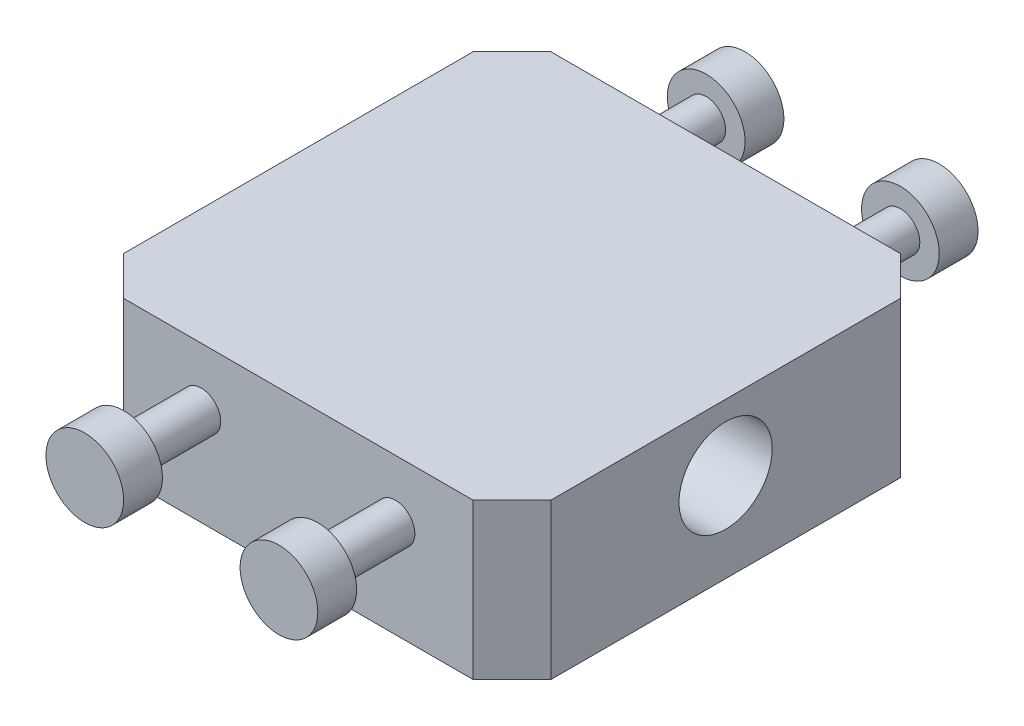
ISO-10303-21;
HEADER;
FILE_DESCRIPTION(('STEP AP214'),'2;1');
FILE_NAME('part.step','',(''),(''),'','','');
FILE_SCHEMA(('AUTOMOTIVE_DESIGN { 1 0 10303 214 1 1 1 1 }'));
ENDSEC;
DATA;
#1=APPLICATION_CONTEXT('core data for automotive mechanical design processes');
#2=APPLICATION_PROTOCOL_DEFINITION('international standard','automotive_design',2000,#1);
#3=PRODUCT_CONTEXT('',#1,'mechanical');
#4=PRODUCT('Part','Part','',(#3));
#5=PRODUCT_RELATED_PRODUCT_CATEGORY('part','',(#4));
#6=PRODUCT_DEFINITION_FORMATION('','',#4);
#7=PRODUCT_DEFINITION_CONTEXT('part definition',#1,'design');
#8=PRODUCT_DEFINITION('design','',#6,#7);
#9=PRODUCT_DEFINITION_SHAPE('','',#8);
#10=(LENGTH_UNIT() NAMED_UNIT(*) SI_UNIT(.MILLI.,.METRE.));
#11=(NAMED_UNIT(*) PLANE_ANGLE_UNIT() SI_UNIT($,.RADIAN.));
#12=(NAMED_UNIT(*) SI_UNIT($,.STERADIAN.) SOLID_ANGLE_UNIT());
#13=UNCERTAINTY_MEASURE_WITH_UNIT(LENGTH_MEASURE(1.E-05),#10,'distance_accuracy_value','');
#14=(GEOMETRIC_REPRESENTATION_CONTEXT(3) GLOBAL_UNCERTAINTY_ASSIGNED_CONTEXT((#13)) GLOBAL_UNIT_ASSIGNED_CONTEXT((#10,
#11,#12)) REPRESENTATION_CONTEXT('',''));
#15=CARTESIAN_POINT('',(0.,0.,0.));
#16=DIRECTION('',(0.,0.,1.));
#17=DIRECTION('',(1.,0.,0.));
#18=AXIS2_PLACEMENT_3D('',#15,#16,#17);
#19=CARTESIAN_POINT('',(0.,30.,0.));
#20=DIRECTION('',(1.,0.,0.));
#21=DIRECTION('',(0.,0.,-1.));
#22=AXIS2_PLACEMENT_3D('',#19,#20,#21);
#23=PLANE('',#22);
#24=CARTESIAN_POINT('',(0.,18.,-55.));
#25=DIRECTION('',(1.,0.,0.));
#26=DIRECTION('',(0.,0.,-1.));
#27=AXIS2_PLACEMENT_3D('',#24,#25,#26);
#28=CIRCLE('',#27,12.);
#29=CARTESIAN_POINT('',(0.,18.,-67.));
#30=VERTEX_POINT('',#29);
#31=EDGE_CURVE('E133',#30,#30,#28,.T.);
#32=ORIENTED_EDGE('',*,*,#31,.T.);
#33=EDGE_LOOP('',(#32));
#34=FACE_BOUND('',#33,.T.);
#35=DIRECTION('',(0.,1.,0.));
#36=VECTOR('',#35,1.);
#37=CARTESIAN_POINT('',(0.,30.,-10.));
#38=LINE('',#37,#36);
#39=CARTESIAN_POINT('',(0.,-5.,-10.));
#40=VERTEX_POINT('',#39);
#41=CARTESIAN_POINT('',(0.,35.,-10.));
#42=VERTEX_POINT('',#41);
#43=EDGE_CURVE('E109',#40,#42,#38,.T.);
#44=ORIENTED_EDGE('',*,*,#43,.T.);
#45=DIRECTION('',(0.,0.,1.));
#46=VECTOR('',#45,1.);
#47=CARTESIAN_POINT('',(0.,35.,-10.));
#48=LINE('',#47,#46);
#49=CARTESIAN_POINT('',(0.,35.,-100.));
#50=VERTEX_POINT('',#49);
#51=EDGE_CURVE('E156',#50,#42,#48,.T.);
#52=ORIENTED_EDGE('',*,*,#51,.F.);
#53=DIRECTION('',(0.,-1.,0.));
#54=VECTOR('',#53,1.);
#55=CARTESIAN_POINT('',(0.,30.,-100.));
#56=LINE('',#55,#54);
#57=CARTESIAN_POINT('',(0.,-5.,-100.));
#58=VERTEX_POINT('',#57);
#59=EDGE_CURVE('E118',#50,#58,#56,.T.);
#60=ORIENTED_EDGE('',*,*,#59,.T.);
#61=DIRECTION('',(0.,0.,-1.));
#62=VECTOR('',#61,1.);
#63=CARTESIAN_POINT('',(0.,-5.,-100.));
#64=LINE('',#63,#62);
#65=EDGE_CURVE('E122',#40,#58,#64,.T.);
#66=ORIENTED_EDGE('',*,*,#65,.F.);
#67=EDGE_LOOP('',(#44,#52,#60,#66));
#68=FACE_BOUND('',#67,.T.);
#69=ADVANCED_FACE('F41',(#34,#68),#23,.F.);
#70=CARTESIAN_POINT('',(0.,30.,0.));
#71=DIRECTION('',(0.,0.,-1.));
#72=DIRECTION('',(-1.,0.,0.));
#73=AXIS2_PLACEMENT_3D('',#70,#71,#72);
#74=PLANE('',#73);
#75=CARTESIAN_POINT('',(80.,20.,0.));
#76=DIRECTION('',(0.,0.,-1.));
#77=DIRECTION('',(-1.,0.,0.));
#78=AXIS2_PLACEMENT_3D('',#75,#76,#77);
#79=CIRCLE('',#78,5.);
#80=CARTESIAN_POINT('',(75.,20.,0.));
#81=VERTEX_POINT('',#80);
#82=EDGE_CURVE('E221',#81,#81,#79,.F.);
#83=ORIENTED_EDGE('',*,*,#82,.F.);
#84=EDGE_LOOP('',(#83));
#85=FACE_BOUND('',#84,.T.);
#86=CARTESIAN_POINT('',(30.,20.,0.));
#87=DIRECTION('',(0.,0.,-1.));
#88=DIRECTION('',(-1.,0.,0.));
#89=AXIS2_PLACEMENT_3D('',#86,#87,#88);
#90=CIRCLE('',#89,5.);
#91=CARTESIAN_POINT('',(25.,20.,0.));
#92=VERTEX_POINT('',#91);
#93=EDGE_CURVE('E218',#92,#92,#90,.F.);
#94=ORIENTED_EDGE('',*,*,#93,.F.);
#95=EDGE_LOOP('',(#94));
#96=FACE_BOUND('',#95,.T.);
#97=DIRECTION('',(0.,-1.,0.));
#98=VECTOR('',#97,1.);
#99=CARTESIAN_POINT('',(9.99999999999998,30.,0.));
#100=LINE('',#99,#98);
#101=CARTESIAN_POINT('',(9.99999999999998,35.,0.));
#102=VERTEX_POINT('',#101);
#103=CARTESIAN_POINT('',(9.99999999999998,-5.,0.));
#104=VERTEX_POINT('',#103);
#105=EDGE_CURVE('E214',#102,#104,#100,.T.);
#106=ORIENTED_EDGE('',*,*,#105,.T.);
#107=DIRECTION('',(-1.,0.,0.));
#108=VECTOR('',#107,1.);
#109=CARTESIAN_POINT('',(9.99999999999998,-5.,0.));
#110=LINE('',#109,#108);
#111=CARTESIAN_POINT('',(100.,-5.,0.));
#112=VERTEX_POINT('',#111);
#113=EDGE_CURVE('E132',#112,#104,#110,.T.);
#114=ORIENTED_EDGE('',*,*,#113,.F.);
#115=DIRECTION('',(0.,1.,0.));
#116=VECTOR('',#115,1.);
#117=CARTESIAN_POINT('',(100.,30.,0.));
#118=LINE('',#117,#116);
#119=CARTESIAN_POINT('',(100.,35.,0.));
#120=VERTEX_POINT('',#119);
#121=EDGE_CURVE('E216',#112,#120,#118,.T.);
#122=ORIENTED_EDGE('',*,*,#121,.T.);
#123=DIRECTION('',(1.,0.,0.));
#124=VECTOR('',#123,1.);
#125=CARTESIAN_POINT('',(100.,35.,0.));
#126=LINE('',#125,#124);
#127=EDGE_CURVE('E159',#102,#120,#126,.T.);
#128=ORIENTED_EDGE('',*,*,#127,.F.);
#129=EDGE_LOOP('',(#106,#114,#122,#128));
#130=FACE_BOUND('',#129,.T.);
#131=ADVANCED_FACE('F246',(#85,#96,#130),#74,.F.);
#132=CARTESIAN_POINT('',(110.,30.,0.));
#133=DIRECTION('',(-1.,0.,0.));
#134=DIRECTION('',(0.,0.,1.));
#135=AXIS2_PLACEMENT_3D('',#132,#133,#134);
#136=PLANE('',#135);
#137=CARTESIAN_POINT('',(110.,18.,-55.));
#138=DIRECTION('',(1.,0.,0.));
#139=DIRECTION('',(0.,0.,-1.));
#140=AXIS2_PLACEMENT_3D('',#137,#138,#139);
#141=CIRCLE('',#140,12.);
#142=CARTESIAN_POINT('',(110.,18.,-67.));
#143=VERTEX_POINT('',#142);
#144=EDGE_CURVE('E136',#143,#143,#141,.T.);
#145=ORIENTED_EDGE('',*,*,#144,.F.);
#146=EDGE_LOOP('',(#145));
#147=FACE_BOUND('',#146,.T.);
#148=DIRECTION('',(0.,-1.,0.));
#149=VECTOR('',#148,1.);
#150=CARTESIAN_POINT('',(110.,30.,-9.99999999999998));
#151=LINE('',#150,#149);
#152=CARTESIAN_POINT('',(110.,35.,-9.99999999999998));
#153=VERTEX_POINT('',#152);
#154=CARTESIAN_POINT('',(110.,-5.,-9.99999999999998));
#155=VERTEX_POINT('',#154);
#156=EDGE_CURVE('E210',#153,#155,#151,.T.);
#157=ORIENTED_EDGE('',*,*,#156,.T.);
#158=DIRECTION('',(0.,0.,1.));
#159=VECTOR('',#158,1.);
#160=CARTESIAN_POINT('',(110.,-5.,-9.99999999999998));
#161=LINE('',#160,#159);
#162=CARTESIAN_POINT('',(110.,-5.,-100.));
#163=VERTEX_POINT('',#162);
#164=EDGE_CURVE('E147',#163,#155,#161,.T.);
#165=ORIENTED_EDGE('',*,*,#164,.F.);
#166=DIRECTION('',(0.,1.,0.));
#167=VECTOR('',#166,1.);
#168=CARTESIAN_POINT('',(110.,30.,-100.));
#169=LINE('',#168,#167);
#170=CARTESIAN_POINT('',(110.,35.,-100.));
#171=VERTEX_POINT('',#170);
#172=EDGE_CURVE('E212',#163,#171,#169,.T.);
#173=ORIENTED_EDGE('',*,*,#172,.T.);
#174=DIRECTION('',(0.,0.,-1.));
#175=VECTOR('',#174,1.);
#176=CARTESIAN_POINT('',(110.,35.,-100.));
#177=LINE('',#176,#175);
#178=EDGE_CURVE('E165',#153,#171,#177,.T.);
#179=ORIENTED_EDGE('',*,*,#178,.F.);
#180=EDGE_LOOP('',(#157,#165,#173,#179));
#181=FACE_BOUND('',#180,.T.);
#182=ADVANCED_FACE('F231',(#147,#181),#136,.F.);
#183=CARTESIAN_POINT('',(0.,30.,-110.));
#184=DIRECTION('',(0.,0.,1.));
#185=DIRECTION('',(1.,0.,0.));
#186=AXIS2_PLACEMENT_3D('',#183,#184,#185);
#187=PLANE('',#186);
#188=CARTESIAN_POINT('',(30.,20.,-110.));
#189=DIRECTION('',(0.,0.,1.));
#190=DIRECTION('',(1.,0.,0.));
#191=AXIS2_PLACEMENT_3D('',#188,#189,#190);
#192=CIRCLE('',#191,5.);
#193=CARTESIAN_POINT('',(35.,20.,-110.));
#194=VERTEX_POINT('',#193);
#195=EDGE_CURVE('E11',#194,#194,#192,.F.);
#196=ORIENTED_EDGE('',*,*,#195,.F.);
#197=EDGE_LOOP('',(#196));
#198=FACE_BOUND('',#197,.T.);
#199=CARTESIAN_POINT('',(80.,20.,-110.));
#200=DIRECTION('',(0.,0.,1.));
#201=DIRECTION('',(1.,0.,0.));
#202=AXIS2_PLACEMENT_3D('',#199,#200,#201);
#203=CIRCLE('',#202,5.);
#204=CARTESIAN_POINT('',(85.,20.,-110.));
#205=VERTEX_POINT('',#204);
#206=EDGE_CURVE('E50',#205,#205,#203,.F.);
#207=ORIENTED_EDGE('',*,*,#206,.F.);
#208=EDGE_LOOP('',(#207));
#209=FACE_BOUND('',#208,.T.);
#210=DIRECTION('',(0.,-1.,0.));
#211=VECTOR('',#210,1.);
#212=CARTESIAN_POINT('',(100.,30.,-110.));
#213=LINE('',#212,#211);
#214=CARTESIAN_POINT('',(100.,35.,-110.));
#215=VERTEX_POINT('',#214);
#216=CARTESIAN_POINT('',(100.,-5.,-110.));
#217=VERTEX_POINT('',#216);
#218=EDGE_CURVE('E65',#215,#217,#213,.T.);
#219=ORIENTED_EDGE('',*,*,#218,.T.);
#220=DIRECTION('',(1.,0.,0.));
#221=VECTOR('',#220,1.);
#222=CARTESIAN_POINT('',(100.,-5.,-110.));
#223=LINE('',#222,#221);
#224=CARTESIAN_POINT('',(10.,-5.,-110.));
#225=VERTEX_POINT('',#224);
#226=EDGE_CURVE('E141',#225,#217,#223,.T.);
#227=ORIENTED_EDGE('',*,*,#226,.F.);
#228=DIRECTION('',(0.,1.,0.));
#229=VECTOR('',#228,1.);
#230=CARTESIAN_POINT('',(10.,30.,-110.));
#231=LINE('',#230,#229);
#232=CARTESIAN_POINT('',(10.,35.,-110.));
#233=VERTEX_POINT('',#232);
#234=EDGE_CURVE('E57',#225,#233,#231,.T.);
#235=ORIENTED_EDGE('',*,*,#234,.T.);
#236=DIRECTION('',(-1.,0.,0.));
#237=VECTOR('',#236,1.);
#238=CARTESIAN_POINT('',(10.,35.,-110.));
#239=LINE('',#238,#237);
#240=EDGE_CURVE('E170',#215,#233,#239,.T.);
#241=ORIENTED_EDGE('',*,*,#240,.F.);
#242=EDGE_LOOP('',(#219,#227,#235,#241));
#243=FACE_BOUND('',#242,.T.);
#244=ADVANCED_FACE('F228',(#198,#209,#243),#187,.F.);
#245=CARTESIAN_POINT('',(0.,30.,-100.));
#246=DIRECTION('',(0.707106781186546,0.,0.707106781186549));
#247=DIRECTION('',(0.,-1.,0.));
#248=AXIS2_PLACEMENT_3D('',#245,#246,#247);
#249=PLANE('',#248);
#250=ORIENTED_EDGE('',*,*,#59,.F.);
#251=DIRECTION('',(-0.707106781186549,0.,0.707106781186546));
#252=VECTOR('',#251,1.);
#253=CARTESIAN_POINT('',(0.,35.,-100.));
#254=LINE('',#253,#252);
#255=EDGE_CURVE('E153',#233,#50,#254,.T.);
#256=ORIENTED_EDGE('',*,*,#255,.F.);
#257=ORIENTED_EDGE('',*,*,#234,.F.);
#258=DIRECTION('',(0.707106781186549,0.,-0.707106781186546));
#259=VECTOR('',#258,1.);
#260=CARTESIAN_POINT('',(10.,-5.,-110.));
#261=LINE('',#260,#259);
#262=EDGE_CURVE('E126',#58,#225,#261,.T.);
#263=ORIENTED_EDGE('',*,*,#262,.F.);
#264=EDGE_LOOP('',(#250,#256,#257,#263));
#265=FACE_BOUND('',#264,.T.);
#266=ADVANCED_FACE('F230',(#265),#249,.F.);
#267=CARTESIAN_POINT('',(100.,30.,-110.));
#268=DIRECTION('',(-0.707106781186549,0.,0.707106781186546));
#269=DIRECTION('',(0.,-1.,0.));
#270=AXIS2_PLACEMENT_3D('',#267,#268,#269);
#271=PLANE('',#270);
#272=ORIENTED_EDGE('',*,*,#218,.F.);
#273=DIRECTION('',(-0.707106781186546,0.,-0.707106781186549));
#274=VECTOR('',#273,1.);
#275=CARTESIAN_POINT('',(100.,35.,-110.));
#276=LINE('',#275,#274);
#277=EDGE_CURVE('E168',#171,#215,#276,.T.);
#278=ORIENTED_EDGE('',*,*,#277,.F.);
#279=ORIENTED_EDGE('',*,*,#172,.F.);
#280=DIRECTION('',(0.707106781186546,0.,0.707106781186549));
#281=VECTOR('',#280,1.);
#282=CARTESIAN_POINT('',(110.,-5.,-100.));
#283=LINE('',#282,#281);
#284=EDGE_CURVE('E144',#217,#163,#283,.T.);
#285=ORIENTED_EDGE('',*,*,#284,.F.);
#286=EDGE_LOOP('',(#272,#278,#279,#285));
#287=FACE_BOUND('',#286,.T.);
#288=ADVANCED_FACE('F235',(#287),#271,.F.);
#289=CARTESIAN_POINT('',(110.,30.,-9.99999999999998));
#290=DIRECTION('',(-0.707106781186546,0.,-0.707106781186548));
#291=DIRECTION('',(0.,-1.,0.));
#292=AXIS2_PLACEMENT_3D('',#289,#290,#291);
#293=PLANE('',#292);
#294=ORIENTED_EDGE('',*,*,#156,.F.);
#295=DIRECTION('',(0.707106781186548,0.,-0.707106781186546));
#296=VECTOR('',#295,1.);
#297=CARTESIAN_POINT('',(110.,35.,-9.99999999999998));
#298=LINE('',#297,#296);
#299=EDGE_CURVE('E162',#120,#153,#298,.T.);
#300=ORIENTED_EDGE('',*,*,#299,.F.);
#301=ORIENTED_EDGE('',*,*,#121,.F.);
#302=DIRECTION('',(-0.707106781186548,0.,0.707106781186546));
#303=VECTOR('',#302,1.);
#304=CARTESIAN_POINT('',(100.,-5.,0.));
#305=LINE('',#304,#303);
#306=EDGE_CURVE('E150',#155,#112,#305,.T.);
#307=ORIENTED_EDGE('',*,*,#306,.F.);
#308=EDGE_LOOP('',(#294,#300,#301,#307));
#309=FACE_BOUND('',#308,.T.);
#310=ADVANCED_FACE('F243',(#309),#293,.F.);
#311=CARTESIAN_POINT('',(9.99999999999998,30.,0.));
#312=DIRECTION('',(0.707106781186548,0.,-0.707106781186546));
#313=DIRECTION('',(0.,-1.,0.));
#314=AXIS2_PLACEMENT_3D('',#311,#312,#313);
#315=PLANE('',#314);
#316=ORIENTED_EDGE('',*,*,#105,.F.);
#317=DIRECTION('',(0.707106781186546,0.,0.707106781186548));
#318=VECTOR('',#317,1.);
#319=CARTESIAN_POINT('',(9.99999999999998,35.,0.));
#320=LINE('',#319,#318);
#321=EDGE_CURVE('E114',#42,#102,#320,.T.);
#322=ORIENTED_EDGE('',*,*,#321,.F.);
#323=ORIENTED_EDGE('',*,*,#43,.F.);
#324=DIRECTION('',(-0.707106781186546,0.,-0.707106781186548));
#325=VECTOR('',#324,1.);
#326=CARTESIAN_POINT('',(0.,-5.,-10.));
#327=LINE('',#326,#325);
#328=EDGE_CURVE('E112',#104,#40,#327,.T.);
#329=ORIENTED_EDGE('',*,*,#328,.F.);
#330=EDGE_LOOP('',(#316,#322,#323,#329));
#331=FACE_BOUND('',#330,.T.);
#332=ADVANCED_FACE('F44',(#331),#315,.F.);
#333=CARTESIAN_POINT('',(30.,20.,20.));
#334=DIRECTION('',(0.,0.,-1.));
#335=DIRECTION('',(-1.,0.,0.));
#336=AXIS2_PLACEMENT_3D('',#333,#334,#335);
#337=CYLINDRICAL_SURFACE('',#336,5.);
#338=CARTESIAN_POINT('',(30.,20.,20.));
#339=DIRECTION('',(0.,0.,1.));
#340=DIRECTION('',(1.,0.,0.));
#341=AXIS2_PLACEMENT_3D('',#338,#339,#340);
#342=CIRCLE('',#341,5.);
#343=CARTESIAN_POINT('',(35.,20.,20.));
#344=VERTEX_POINT('',#343);
#345=EDGE_CURVE('E119',#344,#344,#342,.T.);
#346=ORIENTED_EDGE('',*,*,#345,.F.);
#347=EDGE_LOOP('',(#346));
#348=FACE_BOUND('',#347,.T.);
#349=ORIENTED_EDGE('',*,*,#93,.T.);
#350=EDGE_LOOP('',(#349));
#351=FACE_BOUND('',#350,.T.);
#352=ADVANCED_FACE('F268',(#348,#351),#337,.T.);
#353=CARTESIAN_POINT('',(80.,20.,20.));
#354=DIRECTION('',(0.,0.,-1.));
#355=DIRECTION('',(-1.,0.,0.));
#356=AXIS2_PLACEMENT_3D('',#353,#354,#355);
#357=CYLINDRICAL_SURFACE('',#356,5.);
#358=CARTESIAN_POINT('',(80.,20.,20.));
#359=DIRECTION('',(0.,0.,1.));
#360=DIRECTION('',(1.,0.,0.));
#361=AXIS2_PLACEMENT_3D('',#358,#359,#360);
#362=CIRCLE('',#361,5.);
#363=CARTESIAN_POINT('',(85.,20.,20.));
#364=VERTEX_POINT('',#363);
#365=EDGE_CURVE('E202',#364,#364,#362,.T.);
#366=ORIENTED_EDGE('',*,*,#365,.F.);
#367=EDGE_LOOP('',(#366));
#368=FACE_BOUND('',#367,.T.);
#369=ORIENTED_EDGE('',*,*,#82,.T.);
#370=EDGE_LOOP('',(#369));
#371=FACE_BOUND('',#370,.T.);
#372=ADVANCED_FACE('F271',(#368,#371),#357,.T.);
#373=CARTESIAN_POINT('',(80.,20.,-130.));
#374=DIRECTION('',(0.,0.,1.));
#375=DIRECTION('',(1.,0.,0.));
#376=AXIS2_PLACEMENT_3D('',#373,#374,#375);
#377=CYLINDRICAL_SURFACE('',#376,5.);
#378=CARTESIAN_POINT('',(80.,20.,-130.));
#379=DIRECTION('',(0.,0.,-1.));
#380=DIRECTION('',(-1.,0.,0.));
#381=AXIS2_PLACEMENT_3D('',#378,#379,#380);
#382=CIRCLE('',#381,5.);
#383=CARTESIAN_POINT('',(75.,20.,-130.));
#384=VERTEX_POINT('',#383);
#385=EDGE_CURVE('E199',#384,#384,#382,.T.);
#386=ORIENTED_EDGE('',*,*,#385,.F.);
#387=EDGE_LOOP('',(#386));
#388=FACE_BOUND('',#387,.T.);
#389=ORIENTED_EDGE('',*,*,#206,.T.);
#390=EDGE_LOOP('',(#389));
#391=FACE_BOUND('',#390,.T.);
#392=ADVANCED_FACE('F226',(#388,#391),#377,.T.);
#393=CARTESIAN_POINT('',(30.,20.,-130.));
#394=DIRECTION('',(0.,0.,1.));
#395=DIRECTION('',(1.,0.,0.));
#396=AXIS2_PLACEMENT_3D('',#393,#394,#395);
#397=CYLINDRICAL_SURFACE('',#396,5.);
#398=CARTESIAN_POINT('',(30.,20.,-130.));
#399=DIRECTION('',(0.,0.,-1.));
#400=DIRECTION('',(-1.,0.,0.));
#401=AXIS2_PLACEMENT_3D('',#398,#399,#400);
#402=CIRCLE('',#401,5.);
#403=CARTESIAN_POINT('',(25.,20.,-130.));
#404=VERTEX_POINT('',#403);
#405=EDGE_CURVE('E194',#404,#404,#402,.T.);
#406=ORIENTED_EDGE('',*,*,#405,.F.);
#407=EDGE_LOOP('',(#406));
#408=FACE_BOUND('',#407,.T.);
#409=ORIENTED_EDGE('',*,*,#195,.T.);
#410=EDGE_LOOP('',(#409));
#411=FACE_BOUND('',#410,.T.);
#412=ADVANCED_FACE('F278',(#408,#411),#397,.T.);
#413=CARTESIAN_POINT('',(80.,20.,-140.));
#414=DIRECTION('',(0.,0.,1.));
#415=DIRECTION('',(1.,0.,0.));
#416=AXIS2_PLACEMENT_3D('',#413,#414,#415);
#417=CYLINDRICAL_SURFACE('',#416,9.99999999999999);
#418=CARTESIAN_POINT('',(80.,20.,-140.));
#419=DIRECTION('',(0.,0.,-1.));
#420=DIRECTION('',(-1.,0.,0.));
#421=AXIS2_PLACEMENT_3D('',#418,#419,#420);
#422=CIRCLE('',#421,9.99999999999999);
#423=CARTESIAN_POINT('',(70.,20.,-140.));
#424=VERTEX_POINT('',#423);
#425=EDGE_CURVE('E191',#424,#424,#422,.T.);
#426=ORIENTED_EDGE('',*,*,#425,.F.);
#427=EDGE_LOOP('',(#426));
#428=FACE_BOUND('',#427,.T.);
#429=CARTESIAN_POINT('',(80.,20.,-130.));
#430=DIRECTION('',(0.,0.,-1.));
#431=DIRECTION('',(-1.,0.,0.));
#432=AXIS2_PLACEMENT_3D('',#429,#430,#431);
#433=CIRCLE('',#432,9.99999999999999);
#434=CARTESIAN_POINT('',(70.,20.,-130.));
#435=VERTEX_POINT('',#434);
#436=EDGE_CURVE('E188',#435,#435,#433,.T.);
#437=ORIENTED_EDGE('',*,*,#436,.T.);
#438=EDGE_LOOP('',(#437));
#439=FACE_BOUND('',#438,.T.);
#440=ADVANCED_FACE('F282',(#428,#439),#417,.T.);
#441=CARTESIAN_POINT('',(80.,20.,-140.));
#442=DIRECTION('',(0.,0.,-1.));
#443=DIRECTION('',(-1.,0.,0.));
#444=AXIS2_PLACEMENT_3D('',#441,#442,#443);
#445=PLANE('',#444);
#446=ORIENTED_EDGE('',*,*,#425,.T.);
#447=EDGE_LOOP('',(#446));
#448=FACE_BOUND('',#447,.T.);
#449=ADVANCED_FACE('F286',(#448),#445,.T.);
#450=CARTESIAN_POINT('',(80.,20.,-130.));
#451=DIRECTION('',(0.,0.,-1.));
#452=DIRECTION('',(-1.,0.,0.));
#453=AXIS2_PLACEMENT_3D('',#450,#451,#452);
#454=PLANE('',#453);
#455=ORIENTED_EDGE('',*,*,#385,.T.);
#456=EDGE_LOOP('',(#455));
#457=FACE_BOUND('',#456,.T.);
#458=ORIENTED_EDGE('',*,*,#436,.F.);
#459=EDGE_LOOP('',(#458));
#460=FACE_BOUND('',#459,.T.);
#461=ADVANCED_FACE('F288',(#457,#460),#454,.F.);
#462=CARTESIAN_POINT('',(30.,20.,-140.));
#463=DIRECTION('',(0.,0.,1.));
#464=DIRECTION('',(1.,0.,0.));
#465=AXIS2_PLACEMENT_3D('',#462,#463,#464);
#466=CYLINDRICAL_SURFACE('',#465,10.);
#467=CARTESIAN_POINT('',(30.,20.,-140.));
#468=DIRECTION('',(0.,0.,-1.));
#469=DIRECTION('',(-1.,0.,0.));
#470=AXIS2_PLACEMENT_3D('',#467,#468,#469);
#471=CIRCLE('',#470,10.);
#472=CARTESIAN_POINT('',(20.,20.,-140.));
#473=VERTEX_POINT('',#472);
#474=EDGE_CURVE('E185',#473,#473,#471,.T.);
#475=ORIENTED_EDGE('',*,*,#474,.F.);
#476=EDGE_LOOP('',(#475));
#477=FACE_BOUND('',#476,.T.);
#478=CARTESIAN_POINT('',(30.,20.,-130.));
#479=DIRECTION('',(0.,0.,-1.));
#480=DIRECTION('',(-1.,0.,0.));
#481=AXIS2_PLACEMENT_3D('',#478,#479,#480);
#482=CIRCLE('',#481,10.);
#483=CARTESIAN_POINT('',(20.,20.,-130.));
#484=VERTEX_POINT('',#483);
#485=EDGE_CURVE('E182',#484,#484,#482,.T.);
#486=ORIENTED_EDGE('',*,*,#485,.T.);
#487=EDGE_LOOP('',(#486));
#488=FACE_BOUND('',#487,.T.);
#489=ADVANCED_FACE('F291',(#477,#488),#466,.T.);
#490=CARTESIAN_POINT('',(30.,20.,-140.));
#491=DIRECTION('',(0.,0.,-1.));
#492=DIRECTION('',(-1.,0.,0.));
#493=AXIS2_PLACEMENT_3D('',#490,#491,#492);
#494=PLANE('',#493);
#495=ORIENTED_EDGE('',*,*,#474,.T.);
#496=EDGE_LOOP('',(#495));
#497=FACE_BOUND('',#496,.T.);
#498=ADVANCED_FACE('F298',(#497),#494,.T.);
#499=CARTESIAN_POINT('',(30.,20.,-130.));
#500=DIRECTION('',(0.,0.,-1.));
#501=DIRECTION('',(-1.,0.,0.));
#502=AXIS2_PLACEMENT_3D('',#499,#500,#501);
#503=PLANE('',#502);
#504=ORIENTED_EDGE('',*,*,#405,.T.);
#505=EDGE_LOOP('',(#504));
#506=FACE_BOUND('',#505,.T.);
#507=ORIENTED_EDGE('',*,*,#485,.F.);
#508=EDGE_LOOP('',(#507));
#509=FACE_BOUND('',#508,.T.);
#510=ADVANCED_FACE('F300',(#506,#509),#503,.F.);
#511=CARTESIAN_POINT('',(30.,20.,30.));
#512=DIRECTION('',(0.,0.,-1.));
#513=DIRECTION('',(-1.,0.,0.));
#514=AXIS2_PLACEMENT_3D('',#511,#512,#513);
#515=CYLINDRICAL_SURFACE('',#514,10.);
#516=CARTESIAN_POINT('',(30.,20.,30.));
#517=DIRECTION('',(0.,0.,1.));
#518=DIRECTION('',(1.,0.,0.));
#519=AXIS2_PLACEMENT_3D('',#516,#517,#518);
#520=CIRCLE('',#519,10.);
#521=CARTESIAN_POINT('',(40.,20.,30.));
#522=VERTEX_POINT('',#521);
#523=EDGE_CURVE('E179',#522,#522,#520,.T.);
#524=ORIENTED_EDGE('',*,*,#523,.F.);
#525=EDGE_LOOP('',(#524));
#526=FACE_BOUND('',#525,.T.);
#527=CARTESIAN_POINT('',(30.,20.,20.));
#528=DIRECTION('',(0.,0.,1.));
#529=DIRECTION('',(1.,0.,0.));
#530=AXIS2_PLACEMENT_3D('',#527,#528,#529);
#531=CIRCLE('',#530,10.);
#532=CARTESIAN_POINT('',(40.,20.,20.));
#533=VERTEX_POINT('',#532);
#534=EDGE_CURVE('E176',#533,#533,#531,.T.);
#535=ORIENTED_EDGE('',*,*,#534,.T.);
#536=EDGE_LOOP('',(#535));
#537=FACE_BOUND('',#536,.T.);
#538=ADVANCED_FACE('F303',(#526,#537),#515,.T.);
#539=CARTESIAN_POINT('',(30.,20.,30.));
#540=DIRECTION('',(0.,0.,1.));
#541=DIRECTION('',(1.,0.,0.));
#542=AXIS2_PLACEMENT_3D('',#539,#540,#541);
#543=PLANE('',#542);
#544=ORIENTED_EDGE('',*,*,#523,.T.);
#545=EDGE_LOOP('',(#544));
#546=FACE_BOUND('',#545,.T.);
#547=ADVANCED_FACE('F310',(#546),#543,.T.);
#548=CARTESIAN_POINT('',(30.,20.,20.));
#549=DIRECTION('',(0.,0.,1.));
#550=DIRECTION('',(1.,0.,0.));
#551=AXIS2_PLACEMENT_3D('',#548,#549,#550);
#552=PLANE('',#551);
#553=ORIENTED_EDGE('',*,*,#345,.T.);
#554=EDGE_LOOP('',(#553));
#555=FACE_BOUND('',#554,.T.);
#556=ORIENTED_EDGE('',*,*,#534,.F.);
#557=EDGE_LOOP('',(#556));
#558=FACE_BOUND('',#557,.T.);
#559=ADVANCED_FACE('F312',(#555,#558),#552,.F.);
#560=CARTESIAN_POINT('',(80.,20.,30.));
#561=DIRECTION('',(0.,0.,-1.));
#562=DIRECTION('',(-1.,0.,0.));
#563=AXIS2_PLACEMENT_3D('',#560,#561,#562);
#564=CYLINDRICAL_SURFACE('',#563,9.99999999999999);
#565=CARTESIAN_POINT('',(80.,20.,30.));
#566=DIRECTION('',(0.,0.,1.));
#567=DIRECTION('',(1.,0.,0.));
#568=AXIS2_PLACEMENT_3D('',#565,#566,#567);
#569=CIRCLE('',#568,9.99999999999999);
#570=CARTESIAN_POINT('',(90.,20.,30.));
#571=VERTEX_POINT('',#570);
#572=EDGE_CURVE('E173',#571,#571,#569,.T.);
#573=ORIENTED_EDGE('',*,*,#572,.F.);
#574=EDGE_LOOP('',(#573));
#575=FACE_BOUND('',#574,.T.);
#576=CARTESIAN_POINT('',(80.,20.,20.));
#577=DIRECTION('',(0.,0.,1.));
#578=DIRECTION('',(1.,0.,0.));
#579=AXIS2_PLACEMENT_3D('',#576,#577,#578);
#580=CIRCLE('',#579,9.99999999999999);
#581=CARTESIAN_POINT('',(90.,20.,20.));
#582=VERTEX_POINT('',#581);
#583=EDGE_CURVE('E172',#582,#582,#580,.T.);
#584=ORIENTED_EDGE('',*,*,#583,.T.);
#585=EDGE_LOOP('',(#584));
#586=FACE_BOUND('',#585,.T.);
#587=ADVANCED_FACE('F315',(#575,#586),#564,.T.);
#588=CARTESIAN_POINT('',(80.,20.,30.));
#589=DIRECTION('',(0.,0.,1.));
#590=DIRECTION('',(1.,0.,0.));
#591=AXIS2_PLACEMENT_3D('',#588,#589,#590);
#592=PLANE('',#591);
#593=ORIENTED_EDGE('',*,*,#572,.T.);
#594=EDGE_LOOP('',(#593));
#595=FACE_BOUND('',#594,.T.);
#596=ADVANCED_FACE('F322',(#595),#592,.T.);
#597=CARTESIAN_POINT('',(80.,20.,20.));
#598=DIRECTION('',(0.,0.,1.));
#599=DIRECTION('',(1.,0.,0.));
#600=AXIS2_PLACEMENT_3D('',#597,#598,#599);
#601=PLANE('',#600);
#602=ORIENTED_EDGE('',*,*,#365,.T.);
#603=EDGE_LOOP('',(#602));
#604=FACE_BOUND('',#603,.T.);
#605=ORIENTED_EDGE('',*,*,#583,.F.);
#606=EDGE_LOOP('',(#605));
#607=FACE_BOUND('',#606,.T.);
#608=ADVANCED_FACE('F324',(#604,#607),#601,.F.);
#609=CARTESIAN_POINT('',(0.,35.,0.));
#610=DIRECTION('',(0.,-1.,0.));
#611=DIRECTION('',(0.,0.,-1.));
#612=AXIS2_PLACEMENT_3D('',#609,#610,#611);
#613=PLANE('',#612);
#614=ORIENTED_EDGE('',*,*,#255,.T.);
#615=ORIENTED_EDGE('',*,*,#51,.T.);
#616=ORIENTED_EDGE('',*,*,#321,.T.);
#617=ORIENTED_EDGE('',*,*,#127,.T.);
#618=ORIENTED_EDGE('',*,*,#299,.T.);
#619=ORIENTED_EDGE('',*,*,#178,.T.);
#620=ORIENTED_EDGE('',*,*,#277,.T.);
#621=ORIENTED_EDGE('',*,*,#240,.T.);
#622=EDGE_LOOP('',(#614,#615,#616,#617,#618,#619,#620,#621));
#623=FACE_BOUND('',#622,.T.);
#624=ADVANCED_FACE('F239',(#623),#613,.F.);
#625=CARTESIAN_POINT('',(0.,-5.,0.));
#626=DIRECTION('',(0.,1.,0.));
#627=DIRECTION('',(0.,0.,1.));
#628=AXIS2_PLACEMENT_3D('',#625,#626,#627);
#629=PLANE('',#628);
#630=ORIENTED_EDGE('',*,*,#328,.T.);
#631=ORIENTED_EDGE('',*,*,#65,.T.);
#632=ORIENTED_EDGE('',*,*,#262,.T.);
#633=ORIENTED_EDGE('',*,*,#226,.T.);
#634=ORIENTED_EDGE('',*,*,#284,.T.);
#635=ORIENTED_EDGE('',*,*,#164,.T.);
#636=ORIENTED_EDGE('',*,*,#306,.T.);
#637=ORIENTED_EDGE('',*,*,#113,.T.);
#638=EDGE_LOOP('',(#630,#631,#632,#633,#634,#635,#636,#637));
#639=FACE_BOUND('',#638,.T.);
#640=ADVANCED_FACE('F129',(#639),#629,.F.);
#641=CARTESIAN_POINT('',(-90.,18.,-55.));
#642=DIRECTION('',(1.,0.,0.));
#643=DIRECTION('',(0.,0.,-1.));
#644=AXIS2_PLACEMENT_3D('',#641,#642,#643);
#645=CYLINDRICAL_SURFACE('',#644,12.);
#646=ORIENTED_EDGE('',*,*,#144,.T.);
#647=EDGE_LOOP('',(#646));
#648=FACE_BOUND('',#647,.T.);
#649=ORIENTED_EDGE('',*,*,#31,.F.);
#650=EDGE_LOOP('',(#649));
#651=FACE_BOUND('',#650,.T.);
#652=ADVANCED_FACE('F335',(#648,#651),#645,.F.);
#653=CLOSED_SHELL('',(#69,#131,#182,#244,#266,#288,#310,#332,#352,#372,#392,#412,#440,#449,#461,
#489,#498,#510,#538,#547,#559,#587,#596,#608,#624,#640,#652));
#654=MANIFOLD_SOLID_BREP('B2',#653);
#655=ADVANCED_BREP_SHAPE_REPRESENTATION('',(#18,#654),#14);
#656=SHAPE_DEFINITION_REPRESENTATION(#9,#655);
ENDSEC;
END-ISO-10303-21;
